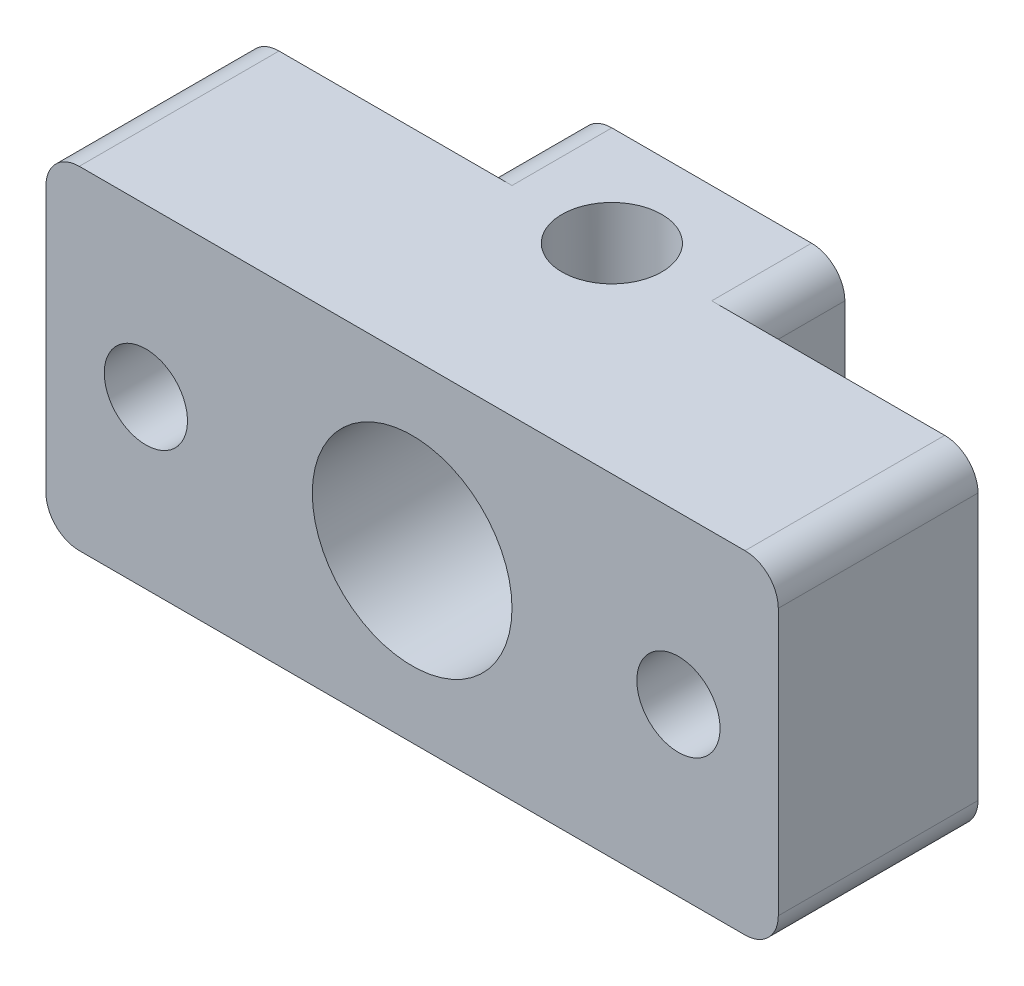
ISO-10303-21;
HEADER;
FILE_DESCRIPTION(('STEP AP214'),'2;1');
FILE_NAME('part.step','',(''),(''),'','','');
FILE_SCHEMA(('AUTOMOTIVE_DESIGN { 1 0 10303 214 1 1 1 1 }'));
ENDSEC;
DATA;
#1=APPLICATION_CONTEXT('core data for automotive mechanical design processes');
#2=APPLICATION_PROTOCOL_DEFINITION('international standard','automotive_design',2000,#1);
#3=PRODUCT_CONTEXT('',#1,'mechanical');
#4=PRODUCT('Part','Part','',(#3));
#5=PRODUCT_RELATED_PRODUCT_CATEGORY('part','',(#4));
#6=PRODUCT_DEFINITION_FORMATION('','',#4);
#7=PRODUCT_DEFINITION_CONTEXT('part definition',#1,'design');
#8=PRODUCT_DEFINITION('design','',#6,#7);
#9=PRODUCT_DEFINITION_SHAPE('','',#8);
#10=(LENGTH_UNIT() NAMED_UNIT(*) SI_UNIT(.MILLI.,.METRE.));
#11=(NAMED_UNIT(*) PLANE_ANGLE_UNIT() SI_UNIT($,.RADIAN.));
#12=(NAMED_UNIT(*) SI_UNIT($,.STERADIAN.) SOLID_ANGLE_UNIT());
#13=UNCERTAINTY_MEASURE_WITH_UNIT(LENGTH_MEASURE(1.E-05),#10,'distance_accuracy_value','');
#14=(GEOMETRIC_REPRESENTATION_CONTEXT(3) GLOBAL_UNCERTAINTY_ASSIGNED_CONTEXT((#13)) GLOBAL_UNIT_ASSIGNED_CONTEXT((#10,
#11,#12)) REPRESENTATION_CONTEXT('',''));
#15=CARTESIAN_POINT('',(0.,0.,0.));
#16=DIRECTION('',(0.,0.,1.));
#17=DIRECTION('',(1.,0.,0.));
#18=AXIS2_PLACEMENT_3D('',#15,#16,#17);
#19=CARTESIAN_POINT('',(0.,0.,9.));
#20=DIRECTION('',(0.,0.,-1.));
#21=DIRECTION('',(-1.,0.,0.));
#22=AXIS2_PLACEMENT_3D('',#19,#20,#21);
#23=PLANE('',#22);
#24=DIRECTION('',(1.,0.,0.));
#25=VECTOR('',#24,1.);
#26=CARTESIAN_POINT('',(-11.,-5.,9.));
#27=LINE('',#26,#25);
#28=CARTESIAN_POINT('',(-10.,-5.,9.));
#29=VERTEX_POINT('',#28);
#30=CARTESIAN_POINT('',(10.,-5.,9.));
#31=VERTEX_POINT('',#30);
#32=EDGE_CURVE('E174',#29,#31,#27,.T.);
#33=ORIENTED_EDGE('',*,*,#32,.T.);
#34=CARTESIAN_POINT('',(10.,-4.,9.));
#35=DIRECTION('',(0.,0.,-1.));
#36=DIRECTION('',(-1.,0.,0.));
#37=AXIS2_PLACEMENT_3D('',#34,#35,#36);
#38=CIRCLE('',#37,1.);
#39=CARTESIAN_POINT('',(11.,-4.,9.));
#40=VERTEX_POINT('',#39);
#41=EDGE_CURVE('E348',#31,#40,#38,.F.);
#42=ORIENTED_EDGE('',*,*,#41,.T.);
#43=DIRECTION('',(0.,1.,0.));
#44=VECTOR('',#43,1.);
#45=CARTESIAN_POINT('',(11.,-5.,9.));
#46=LINE('',#45,#44);
#47=CARTESIAN_POINT('',(11.,4.,9.));
#48=VERTEX_POINT('',#47);
#49=EDGE_CURVE('E228',#40,#48,#46,.T.);
#50=ORIENTED_EDGE('',*,*,#49,.T.);
#51=CARTESIAN_POINT('',(10.,4.,9.));
#52=DIRECTION('',(0.,0.,-1.));
#53=DIRECTION('',(-1.,0.,0.));
#54=AXIS2_PLACEMENT_3D('',#51,#52,#53);
#55=CIRCLE('',#54,1.);
#56=CARTESIAN_POINT('',(10.,5.,9.));
#57=VERTEX_POINT('',#56);
#58=EDGE_CURVE('E341',#48,#57,#55,.F.);
#59=ORIENTED_EDGE('',*,*,#58,.T.);
#60=DIRECTION('',(-1.,0.,0.));
#61=VECTOR('',#60,1.);
#62=CARTESIAN_POINT('',(-11.,5.,9.));
#63=LINE('',#62,#61);
#64=CARTESIAN_POINT('',(-10.,5.,9.));
#65=VERTEX_POINT('',#64);
#66=EDGE_CURVE('E172',#57,#65,#63,.T.);
#67=ORIENTED_EDGE('',*,*,#66,.T.);
#68=CARTESIAN_POINT('',(-10.,4.,9.));
#69=DIRECTION('',(0.,0.,-1.));
#70=DIRECTION('',(-1.,0.,0.));
#71=AXIS2_PLACEMENT_3D('',#68,#69,#70);
#72=CIRCLE('',#71,1.);
#73=CARTESIAN_POINT('',(-11.,4.,9.));
#74=VERTEX_POINT('',#73);
#75=EDGE_CURVE('E343',#65,#74,#72,.F.);
#76=ORIENTED_EDGE('',*,*,#75,.T.);
#77=DIRECTION('',(0.,-1.,0.));
#78=VECTOR('',#77,1.);
#79=CARTESIAN_POINT('',(-11.,-5.,9.));
#80=LINE('',#79,#78);
#81=CARTESIAN_POINT('',(-11.,-4.,9.));
#82=VERTEX_POINT('',#81);
#83=EDGE_CURVE('E233',#74,#82,#80,.T.);
#84=ORIENTED_EDGE('',*,*,#83,.T.);
#85=CARTESIAN_POINT('',(-10.,-4.,9.));
#86=DIRECTION('',(0.,0.,-1.));
#87=DIRECTION('',(-1.,0.,0.));
#88=AXIS2_PLACEMENT_3D('',#85,#86,#87);
#89=CIRCLE('',#88,1.);
#90=EDGE_CURVE('E336',#82,#29,#89,.F.);
#91=ORIENTED_EDGE('',*,*,#90,.T.);
#92=EDGE_LOOP('',(#33,#42,#50,#59,#67,#76,#84,#91));
#93=FACE_BOUND('',#92,.T.);
#94=CARTESIAN_POINT('',(8.,0.,9.));
#95=DIRECTION('',(0.,0.,1.));
#96=DIRECTION('',(1.,0.,0.));
#97=AXIS2_PLACEMENT_3D('',#94,#95,#96);
#98=CIRCLE('',#97,1.25);
#99=CARTESIAN_POINT('',(9.25,0.,9.));
#100=VERTEX_POINT('',#99);
#101=EDGE_CURVE('E224',#100,#100,#98,.T.);
#102=ORIENTED_EDGE('',*,*,#101,.F.);
#103=EDGE_LOOP('',(#102));
#104=FACE_BOUND('',#103,.T.);
#105=CARTESIAN_POINT('',(-8.,0.,9.));
#106=DIRECTION('',(0.,0.,1.));
#107=DIRECTION('',(-1.,0.,0.));
#108=AXIS2_PLACEMENT_3D('',#105,#106,#107);
#109=CIRCLE('',#108,1.25);
#110=CARTESIAN_POINT('',(-9.25,0.,9.));
#111=VERTEX_POINT('',#110);
#112=EDGE_CURVE('E219',#111,#111,#109,.T.);
#113=ORIENTED_EDGE('',*,*,#112,.F.);
#114=EDGE_LOOP('',(#113));
#115=FACE_BOUND('',#114,.T.);
#116=CARTESIAN_POINT('',(0.,0.,9.));
#117=DIRECTION('',(0.,0.,1.));
#118=DIRECTION('',(1.,0.,0.));
#119=AXIS2_PLACEMENT_3D('',#116,#117,#118);
#120=CIRCLE('',#119,3.);
#121=CARTESIAN_POINT('',(3.,0.,9.));
#122=VERTEX_POINT('',#121);
#123=EDGE_CURVE('E216',#122,#122,#120,.T.);
#124=ORIENTED_EDGE('',*,*,#123,.F.);
#125=EDGE_LOOP('',(#124));
#126=FACE_BOUND('',#125,.T.);
#127=ADVANCED_FACE('F37',(#93,#104,#115,#126),#23,.F.);
#128=CARTESIAN_POINT('',(0.,0.,0.));
#129=DIRECTION('',(0.,0.,-1.));
#130=DIRECTION('',(-1.,0.,0.));
#131=AXIS2_PLACEMENT_3D('',#128,#129,#130);
#132=PLANE('',#131);
#133=DIRECTION('',(0.,-1.,0.));
#134=VECTOR('',#133,1.);
#135=CARTESIAN_POINT('',(-4.,5.,0.));
#136=LINE('',#135,#134);
#137=CARTESIAN_POINT('',(-4.,4.,0.));
#138=VERTEX_POINT('',#137);
#139=CARTESIAN_POINT('',(-4.,-4.,0.));
#140=VERTEX_POINT('',#139);
#141=EDGE_CURVE('E196',#138,#140,#136,.T.);
#142=ORIENTED_EDGE('',*,*,#141,.F.);
#143=CARTESIAN_POINT('',(-3.,4.,0.));
#144=DIRECTION('',(0.,0.,-1.));
#145=DIRECTION('',(-1.,0.,0.));
#146=AXIS2_PLACEMENT_3D('',#143,#144,#145);
#147=CIRCLE('',#146,1.);
#148=CARTESIAN_POINT('',(-3.,5.,0.));
#149=VERTEX_POINT('',#148);
#150=EDGE_CURVE('E386',#138,#149,#147,.T.);
#151=ORIENTED_EDGE('',*,*,#150,.T.);
#152=DIRECTION('',(-1.,0.,0.));
#153=VECTOR('',#152,1.);
#154=CARTESIAN_POINT('',(-11.,5.,0.));
#155=LINE('',#154,#153);
#156=CARTESIAN_POINT('',(3.,5.,0.));
#157=VERTEX_POINT('',#156);
#158=EDGE_CURVE('E227',#157,#149,#155,.T.);
#159=ORIENTED_EDGE('',*,*,#158,.F.);
#160=CARTESIAN_POINT('',(3.,4.,0.));
#161=DIRECTION('',(0.,0.,-1.));
#162=DIRECTION('',(-1.,0.,0.));
#163=AXIS2_PLACEMENT_3D('',#160,#161,#162);
#164=CIRCLE('',#163,1.);
#165=CARTESIAN_POINT('',(4.,4.,0.));
#166=VERTEX_POINT('',#165);
#167=EDGE_CURVE('E399',#157,#166,#164,.T.);
#168=ORIENTED_EDGE('',*,*,#167,.T.);
#169=DIRECTION('',(0.,-1.,0.));
#170=VECTOR('',#169,1.);
#171=CARTESIAN_POINT('',(4.,5.,0.));
#172=LINE('',#171,#170);
#173=CARTESIAN_POINT('',(4.,-4.,0.));
#174=VERTEX_POINT('',#173);
#175=EDGE_CURVE('E187',#166,#174,#172,.T.);
#176=ORIENTED_EDGE('',*,*,#175,.T.);
#177=CARTESIAN_POINT('',(3.,-4.,0.));
#178=DIRECTION('',(0.,0.,-1.));
#179=DIRECTION('',(-1.,0.,0.));
#180=AXIS2_PLACEMENT_3D('',#177,#178,#179);
#181=CIRCLE('',#180,1.);
#182=CARTESIAN_POINT('',(3.,-5.,0.));
#183=VERTEX_POINT('',#182);
#184=EDGE_CURVE('E369',#174,#183,#181,.T.);
#185=ORIENTED_EDGE('',*,*,#184,.T.);
#186=DIRECTION('',(1.,0.,0.));
#187=VECTOR('',#186,1.);
#188=CARTESIAN_POINT('',(-11.,-5.,0.));
#189=LINE('',#188,#187);
#190=CARTESIAN_POINT('',(-3.,-5.,0.));
#191=VERTEX_POINT('',#190);
#192=EDGE_CURVE('E231',#191,#183,#189,.T.);
#193=ORIENTED_EDGE('',*,*,#192,.F.);
#194=CARTESIAN_POINT('',(-3.,-4.,0.));
#195=DIRECTION('',(0.,0.,-1.));
#196=DIRECTION('',(-1.,0.,0.));
#197=AXIS2_PLACEMENT_3D('',#194,#195,#196);
#198=CIRCLE('',#197,1.);
#199=EDGE_CURVE('E394',#191,#140,#198,.T.);
#200=ORIENTED_EDGE('',*,*,#199,.T.);
#201=EDGE_LOOP('',(#142,#151,#159,#168,#176,#185,#193,#200));
#202=FACE_BOUND('',#201,.T.);
#203=CARTESIAN_POINT('',(0.,0.,0.));
#204=DIRECTION('',(0.,0.,1.));
#205=DIRECTION('',(1.,0.,0.));
#206=AXIS2_PLACEMENT_3D('',#203,#204,#205);
#207=CIRCLE('',#206,3.);
#208=CARTESIAN_POINT('',(3.,0.,0.));
#209=VERTEX_POINT('',#208);
#210=EDGE_CURVE('E214',#209,#209,#207,.T.);
#211=ORIENTED_EDGE('',*,*,#210,.T.);
#212=EDGE_LOOP('',(#211));
#213=FACE_BOUND('',#212,.T.);
#214=ADVANCED_FACE('F278',(#202,#213),#132,.T.);
#215=CARTESIAN_POINT('',(11.,-5.,9.));
#216=DIRECTION('',(-1.,0.,0.));
#217=DIRECTION('',(0.,0.,1.));
#218=AXIS2_PLACEMENT_3D('',#215,#216,#217);
#219=PLANE('',#218);
#220=ORIENTED_EDGE('',*,*,#49,.F.);
#221=DIRECTION('',(0.,0.,-1.));
#222=VECTOR('',#221,1.);
#223=CARTESIAN_POINT('',(11.,-4.,9.));
#224=LINE('',#223,#222);
#225=CARTESIAN_POINT('',(11.,-4.,3.));
#226=VERTEX_POINT('',#225);
#227=EDGE_CURVE('E163',#40,#226,#224,.T.);
#228=ORIENTED_EDGE('',*,*,#227,.T.);
#229=DIRECTION('',(0.,-1.,0.));
#230=VECTOR('',#229,1.);
#231=CARTESIAN_POINT('',(11.,5.,3.));
#232=LINE('',#231,#230);
#233=CARTESIAN_POINT('',(11.,4.,3.));
#234=VERTEX_POINT('',#233);
#235=EDGE_CURVE('E180',#234,#226,#232,.T.);
#236=ORIENTED_EDGE('',*,*,#235,.F.);
#237=DIRECTION('',(0.,0.,-1.));
#238=VECTOR('',#237,1.);
#239=CARTESIAN_POINT('',(11.,4.,9.));
#240=LINE('',#239,#238);
#241=EDGE_CURVE('E157',#234,#48,#240,.F.);
#242=ORIENTED_EDGE('',*,*,#241,.T.);
#243=EDGE_LOOP('',(#220,#228,#236,#242));
#244=FACE_BOUND('',#243,.T.);
#245=ADVANCED_FACE('F284',(#244),#219,.F.);
#246=CARTESIAN_POINT('',(-11.,5.,9.));
#247=DIRECTION('',(0.,-1.,0.));
#248=DIRECTION('',(0.,0.,-1.));
#249=AXIS2_PLACEMENT_3D('',#246,#247,#248);
#250=PLANE('',#249);
#251=CARTESIAN_POINT('',(0.,5.,3.));
#252=DIRECTION('',(0.,-1.,0.));
#253=DIRECTION('',(0.,0.,-1.));
#254=AXIS2_PLACEMENT_3D('',#251,#252,#253);
#255=CIRCLE('',#254,1.5);
#256=CARTESIAN_POINT('',(0.,5.,1.5));
#257=VERTEX_POINT('',#256);
#258=EDGE_CURVE('E211',#257,#257,#255,.T.);
#259=ORIENTED_EDGE('',*,*,#258,.T.);
#260=EDGE_LOOP('',(#259));
#261=FACE_BOUND('',#260,.T.);
#262=ORIENTED_EDGE('',*,*,#158,.T.);
#263=DIRECTION('',(0.,0.,1.));
#264=VECTOR('',#263,1.);
#265=CARTESIAN_POINT('',(-3.,5.,9.));
#266=LINE('',#265,#264);
#267=CARTESIAN_POINT('',(-3.,5.,3.));
#268=VERTEX_POINT('',#267);
#269=EDGE_CURVE('E406',#149,#268,#266,.T.);
#270=ORIENTED_EDGE('',*,*,#269,.T.);
#271=DIRECTION('',(-1.,0.,0.));
#272=VECTOR('',#271,1.);
#273=CARTESIAN_POINT('',(-11.,5.,3.));
#274=LINE('',#273,#272);
#275=CARTESIAN_POINT('',(-10.,5.,3.));
#276=VERTEX_POINT('',#275);
#277=EDGE_CURVE('E193',#268,#276,#274,.T.);
#278=ORIENTED_EDGE('',*,*,#277,.T.);
#279=DIRECTION('',(0.,0.,-1.));
#280=VECTOR('',#279,1.);
#281=CARTESIAN_POINT('',(-10.,5.,9.));
#282=LINE('',#281,#280);
#283=EDGE_CURVE('E173',#276,#65,#282,.F.);
#284=ORIENTED_EDGE('',*,*,#283,.T.);
#285=ORIENTED_EDGE('',*,*,#66,.F.);
#286=DIRECTION('',(0.,0.,-1.));
#287=VECTOR('',#286,1.);
#288=CARTESIAN_POINT('',(10.,5.,9.));
#289=LINE('',#288,#287);
#290=CARTESIAN_POINT('',(10.,5.,3.));
#291=VERTEX_POINT('',#290);
#292=EDGE_CURVE('E156',#57,#291,#289,.T.);
#293=ORIENTED_EDGE('',*,*,#292,.T.);
#294=DIRECTION('',(-1.,0.,0.));
#295=VECTOR('',#294,1.);
#296=CARTESIAN_POINT('',(11.,5.,3.));
#297=LINE('',#296,#295);
#298=CARTESIAN_POINT('',(3.,5.,3.));
#299=VERTEX_POINT('',#298);
#300=EDGE_CURVE('E170',#291,#299,#297,.T.);
#301=ORIENTED_EDGE('',*,*,#300,.T.);
#302=DIRECTION('',(0.,0.,-1.));
#303=VECTOR('',#302,1.);
#304=CARTESIAN_POINT('',(3.,5.,9.));
#305=LINE('',#304,#303);
#306=EDGE_CURVE('E409',#299,#157,#305,.T.);
#307=ORIENTED_EDGE('',*,*,#306,.T.);
#308=EDGE_LOOP('',(#262,#270,#278,#284,#285,#293,#301,#307));
#309=FACE_BOUND('',#308,.T.);
#310=ADVANCED_FACE('F168',(#261,#309),#250,.F.);
#311=CARTESIAN_POINT('',(-11.,-5.,9.));
#312=DIRECTION('',(1.,0.,0.));
#313=DIRECTION('',(0.,0.,-1.));
#314=AXIS2_PLACEMENT_3D('',#311,#312,#313);
#315=PLANE('',#314);
#316=ORIENTED_EDGE('',*,*,#83,.F.);
#317=DIRECTION('',(0.,0.,-1.));
#318=VECTOR('',#317,1.);
#319=CARTESIAN_POINT('',(-11.,4.,9.));
#320=LINE('',#319,#318);
#321=CARTESIAN_POINT('',(-11.,4.,3.));
#322=VERTEX_POINT('',#321);
#323=EDGE_CURVE('E351',#74,#322,#320,.T.);
#324=ORIENTED_EDGE('',*,*,#323,.T.);
#325=DIRECTION('',(0.,-1.,0.));
#326=VECTOR('',#325,1.);
#327=CARTESIAN_POINT('',(-11.,5.,3.));
#328=LINE('',#327,#326);
#329=CARTESIAN_POINT('',(-11.,-4.,3.));
#330=VERTEX_POINT('',#329);
#331=EDGE_CURVE('E199',#322,#330,#328,.T.);
#332=ORIENTED_EDGE('',*,*,#331,.T.);
#333=DIRECTION('',(0.,0.,-1.));
#334=VECTOR('',#333,1.);
#335=CARTESIAN_POINT('',(-11.,-4.,9.));
#336=LINE('',#335,#334);
#337=EDGE_CURVE('E337',#330,#82,#336,.F.);
#338=ORIENTED_EDGE('',*,*,#337,.T.);
#339=EDGE_LOOP('',(#316,#324,#332,#338));
#340=FACE_BOUND('',#339,.T.);
#341=ADVANCED_FACE('F294',(#340),#315,.F.);
#342=CARTESIAN_POINT('',(-11.,-5.,9.));
#343=DIRECTION('',(0.,1.,0.));
#344=DIRECTION('',(0.,0.,1.));
#345=AXIS2_PLACEMENT_3D('',#342,#343,#344);
#346=PLANE('',#345);
#347=CARTESIAN_POINT('',(0.,-5.,3.));
#348=DIRECTION('',(0.,-1.,0.));
#349=DIRECTION('',(0.,0.,-1.));
#350=AXIS2_PLACEMENT_3D('',#347,#348,#349);
#351=CIRCLE('',#350,1.5);
#352=CARTESIAN_POINT('',(0.,-5.,1.5));
#353=VERTEX_POINT('',#352);
#354=EDGE_CURVE('E207',#353,#353,#351,.T.);
#355=ORIENTED_EDGE('',*,*,#354,.F.);
#356=EDGE_LOOP('',(#355));
#357=FACE_BOUND('',#356,.T.);
#358=DIRECTION('',(-1.,0.,0.));
#359=VECTOR('',#358,1.);
#360=CARTESIAN_POINT('',(-11.,-5.,3.));
#361=LINE('',#360,#359);
#362=CARTESIAN_POINT('',(-3.,-5.,3.));
#363=VERTEX_POINT('',#362);
#364=CARTESIAN_POINT('',(-10.,-5.,3.));
#365=VERTEX_POINT('',#364);
#366=EDGE_CURVE('E197',#363,#365,#361,.T.);
#367=ORIENTED_EDGE('',*,*,#366,.F.);
#368=DIRECTION('',(0.,0.,1.));
#369=VECTOR('',#368,1.);
#370=CARTESIAN_POINT('',(-3.,-5.,9.));
#371=LINE('',#370,#369);
#372=EDGE_CURVE('E372',#363,#191,#371,.F.);
#373=ORIENTED_EDGE('',*,*,#372,.T.);
#374=ORIENTED_EDGE('',*,*,#192,.T.);
#375=DIRECTION('',(0.,0.,-1.));
#376=VECTOR('',#375,1.);
#377=CARTESIAN_POINT('',(3.,-5.,9.));
#378=LINE('',#377,#376);
#379=CARTESIAN_POINT('',(3.,-5.,3.));
#380=VERTEX_POINT('',#379);
#381=EDGE_CURVE('E383',#183,#380,#378,.F.);
#382=ORIENTED_EDGE('',*,*,#381,.T.);
#383=DIRECTION('',(-1.,0.,0.));
#384=VECTOR('',#383,1.);
#385=CARTESIAN_POINT('',(11.,-5.,3.));
#386=LINE('',#385,#384);
#387=CARTESIAN_POINT('',(10.,-5.,3.));
#388=VERTEX_POINT('',#387);
#389=EDGE_CURVE('E181',#388,#380,#386,.T.);
#390=ORIENTED_EDGE('',*,*,#389,.F.);
#391=DIRECTION('',(0.,0.,-1.));
#392=VECTOR('',#391,1.);
#393=CARTESIAN_POINT('',(10.,-5.,9.));
#394=LINE('',#393,#392);
#395=EDGE_CURVE('E382',#388,#31,#394,.F.);
#396=ORIENTED_EDGE('',*,*,#395,.T.);
#397=ORIENTED_EDGE('',*,*,#32,.F.);
#398=DIRECTION('',(0.,0.,-1.));
#399=VECTOR('',#398,1.);
#400=CARTESIAN_POINT('',(-10.,-5.,9.));
#401=LINE('',#400,#399);
#402=EDGE_CURVE('E339',#29,#365,#401,.T.);
#403=ORIENTED_EDGE('',*,*,#402,.T.);
#404=EDGE_LOOP('',(#367,#373,#374,#382,#390,#396,#397,#403));
#405=FACE_BOUND('',#404,.T.);
#406=ADVANCED_FACE('F291',(#357,#405),#346,.F.);
#407=CARTESIAN_POINT('',(8.,0.,9.));
#408=DIRECTION('',(0.,0.,-1.));
#409=DIRECTION('',(-1.,0.,0.));
#410=AXIS2_PLACEMENT_3D('',#407,#408,#409);
#411=CYLINDRICAL_SURFACE('',#410,1.25);
#412=CARTESIAN_POINT('',(8.,0.,3.));
#413=DIRECTION('',(0.,0.,1.));
#414=DIRECTION('',(1.,0.,0.));
#415=AXIS2_PLACEMENT_3D('',#412,#413,#414);
#416=CIRCLE('',#415,1.25);
#417=CARTESIAN_POINT('',(9.25,0.,3.));
#418=VERTEX_POINT('',#417);
#419=EDGE_CURVE('E190',#418,#418,#416,.T.);
#420=ORIENTED_EDGE('',*,*,#419,.F.);
#421=EDGE_LOOP('',(#420));
#422=FACE_BOUND('',#421,.T.);
#423=ORIENTED_EDGE('',*,*,#101,.T.);
#424=EDGE_LOOP('',(#423));
#425=FACE_BOUND('',#424,.T.);
#426=ADVANCED_FACE('F289',(#422,#425),#411,.F.);
#427=CARTESIAN_POINT('',(-8.,0.,9.));
#428=DIRECTION('',(0.,0.,-1.));
#429=DIRECTION('',(-1.,0.,0.));
#430=AXIS2_PLACEMENT_3D('',#427,#428,#429);
#431=CYLINDRICAL_SURFACE('',#430,1.25);
#432=CARTESIAN_POINT('',(-8.,0.,3.));
#433=DIRECTION('',(0.,0.,1.));
#434=DIRECTION('',(1.,0.,0.));
#435=AXIS2_PLACEMENT_3D('',#432,#433,#434);
#436=CIRCLE('',#435,1.25);
#437=CARTESIAN_POINT('',(-6.75,0.,3.));
#438=VERTEX_POINT('',#437);
#439=EDGE_CURVE('E201',#438,#438,#436,.T.);
#440=ORIENTED_EDGE('',*,*,#439,.F.);
#441=EDGE_LOOP('',(#440));
#442=FACE_BOUND('',#441,.T.);
#443=ORIENTED_EDGE('',*,*,#112,.T.);
#444=EDGE_LOOP('',(#443));
#445=FACE_BOUND('',#444,.T.);
#446=ADVANCED_FACE('F416',(#442,#445),#431,.F.);
#447=CARTESIAN_POINT('',(0.,0.,9.));
#448=DIRECTION('',(0.,0.,-1.));
#449=DIRECTION('',(-1.,0.,0.));
#450=AXIS2_PLACEMENT_3D('',#447,#448,#449);
#451=CYLINDRICAL_SURFACE('',#450,3.);
#452=CARTESIAN_POINT('',(0.,3.,1.5));
#453=CARTESIAN_POINT('',(0.0788579444268502,2.99999570107562,1.50000495347579));
#454=CARTESIAN_POINT('',(0.157809899546344,2.99685736529635,1.50625510968158));
#455=CARTESIAN_POINT('',(0.313380352903344,2.98461234055736,1.53097932051231));
#456=CARTESIAN_POINT('',(0.389994130070444,2.9754943174338,1.54947658949672));
#457=CARTESIAN_POINT('',(0.538400317320673,2.95224419105063,1.59779071292494));
#458=CARTESIAN_POINT('',(0.610210204408719,2.93813158766306,1.62756357637195));
#459=CARTESIAN_POINT('',(0.747708925209898,2.90618664773642,1.69735593204748));
#460=CARTESIAN_POINT('',(0.813398240985089,2.88835460450288,1.7373746163733));
#461=CARTESIAN_POINT('',(0.941261726642864,2.84934387387093,1.82927587422793));
#462=CARTESIAN_POINT('',(1.00298281668316,2.82802798691306,1.88172971885946));
#463=CARTESIAN_POINT('',(1.11716916730047,2.78489955370115,1.99578221887055));
#464=CARTESIAN_POINT('',(1.16962737466015,2.76308664313552,2.05738777765866));
#465=CARTESIAN_POINT('',(1.26787800067542,2.71948426796021,2.19372502428507));
#466=CARTESIAN_POINT('',(1.31283800332746,2.69782780455198,2.26910414751887));
#467=CARTESIAN_POINT('',(1.38925234033604,2.65928968158481,2.42755100397932));
#468=CARTESIAN_POINT('',(1.4207163224495,2.64240461410485,2.51061319308412));
#469=CARTESIAN_POINT('',(1.46719866328288,2.61686800556713,2.67699765813288));
#470=CARTESIAN_POINT('',(1.48308878562066,2.6077840737557,2.76000667810109));
#471=CARTESIAN_POINT('',(1.50064048996327,2.59772834922792,2.92796825666921));
#472=CARTESIAN_POINT('',(1.50231613255961,2.59674854014932,3.01291881130673));
#473=CARTESIAN_POINT('',(1.49203093075844,2.60266395385873,3.17142903647305));
#474=CARTESIAN_POINT('',(1.48167683930523,2.6086314549302,3.24513604683457));
#475=CARTESIAN_POINT('',(1.4504097735854,2.62614343100776,3.38958286405956));
#476=CARTESIAN_POINT('',(1.42949343584648,2.63768968247665,3.46032171795797));
#477=CARTESIAN_POINT('',(1.37731467057901,2.66531214619112,3.59884369884849));
#478=CARTESIAN_POINT('',(1.34582260067399,2.68148760995998,3.66651959817868));
#479=CARTESIAN_POINT('',(1.273562531502,2.71655106422106,3.79595143888501));
#480=CARTESIAN_POINT('',(1.2327903657187,2.73544027170286,3.85770470340013));
#481=CARTESIAN_POINT('',(1.13709908236918,2.77669736854929,3.98178187911484));
#482=CARTESIAN_POINT('',(1.08104168755392,2.79920265355119,4.04318531036424));
#483=CARTESIAN_POINT('',(0.95933336811206,2.84321434950611,4.15610312788635));
#484=CARTESIAN_POINT('',(0.893677884861428,2.86472027938202,4.20761278805082));
#485=CARTESIAN_POINT('',(0.750774758747773,2.90552980924446,4.30152849154459));
#486=CARTESIAN_POINT('',(0.673130387399113,2.92468476243011,4.34340070866861));
#487=CARTESIAN_POINT('',(0.510699323233195,2.95736821681864,4.41314554356451));
#488=CARTESIAN_POINT('',(0.425918364397914,2.9709011841533,4.44102927752275));
#489=CARTESIAN_POINT('',(0.259149737491053,2.98986500612153,4.47971310557501));
#490=CARTESIAN_POINT('',(0.177512295822489,2.99587407451965,4.49173685362017));
#491=CARTESIAN_POINT('',(0.0131693999240272,3.00109520188656,4.50219709670173));
#492=CARTESIAN_POINT('',(-0.0695355298048633,3.00031048081978,4.5006400284592));
#493=CARTESIAN_POINT('',(-0.226849457978981,2.99236788380153,4.48468996737188));
#494=CARTESIAN_POINT('',(-0.301589112074895,2.98570868532253,4.47130120090501));
#495=CARTESIAN_POINT('',(-0.447610338452912,2.96733256972261,4.43364289215732));
#496=CARTESIAN_POINT('',(-0.51889152853663,2.95561509501618,4.40937215031976));
#497=CARTESIAN_POINT('',(-0.658332912674359,2.92776377120382,4.35000230035045));
#498=CARTESIAN_POINT('',(-0.726345595508705,2.91151322654446,4.31461342482557));
#499=CARTESIAN_POINT('',(-0.855692042548907,2.87615961476127,4.23433869653015));
#500=CARTESIAN_POINT('',(-0.917022944664887,2.85705533350408,4.18944879810691));
#501=CARTESIAN_POINT('',(-1.03765153393382,2.81562332004297,4.08635936200392));
#502=CARTESIAN_POINT('',(-1.09615811672854,2.79316327265249,4.02728569733228));
#503=CARTESIAN_POINT('',(-1.20278448167828,2.7489358741323,3.90011227308341));
#504=CARTESIAN_POINT('',(-1.25089707856781,2.72716901100071,3.83200632172812));
#505=CARTESIAN_POINT('',(-1.33756187171853,2.68576788309734,3.68453451874054));
#506=CARTESIAN_POINT('',(-1.37553824370037,2.66628794383591,3.60478310085828));
#507=CARTESIAN_POINT('',(-1.43712423890206,2.63361108441202,3.43873489863755));
#508=CARTESIAN_POINT('',(-1.46075237380052,2.62040607332625,3.35244671029966));
#509=CARTESIAN_POINT('',(-1.49079253120031,2.60342251538703,3.18463466567294));
#510=CARTESIAN_POINT('',(-1.49863949460818,2.59886075197598,3.10344861984714));
#511=CARTESIAN_POINT('',(-1.5010337315643,2.59748031962405,2.94082939925321));
#512=CARTESIAN_POINT('',(-1.49558676993486,2.60065829439585,2.85939634689321));
#513=CARTESIAN_POINT('',(-1.47288918838996,2.61356793076615,2.70677474769984));
#514=CARTESIAN_POINT('',(-1.45681247151455,2.62264641723988,2.63534929478289));
#515=CARTESIAN_POINT('',(-1.41476303733662,2.64556524281479,2.49628782086345));
#516=CARTESIAN_POINT('',(-1.38878713673988,2.65940711354503,2.42865302686195));
#517=CARTESIAN_POINT('',(-1.32572361795085,2.69142795546804,2.29406272352019));
#518=CARTESIAN_POINT('',(-1.28800670672355,2.70983583593881,2.22745814725646));
#519=CARTESIAN_POINT('',(-1.20322645745609,2.74852997452291,2.10108819572811));
#520=CARTESIAN_POINT('',(-1.15615825686234,2.76881720693416,2.04132640421833));
#521=CARTESIAN_POINT('',(-1.04730498999206,2.81193484737138,1.92278702646799));
#522=CARTESIAN_POINT('',(-0.984426634495892,2.83477474959942,1.86501134647456));
#523=CARTESIAN_POINT('',(-0.849232209349796,2.87816628389896,1.76060552484709));
#524=CARTESIAN_POINT('',(-0.776911084957796,2.89871667939293,1.71398139079514));
#525=CARTESIAN_POINT('',(-0.623897395174419,2.93547014349806,1.63314545593189));
#526=CARTESIAN_POINT('',(-0.543149255665096,2.951641447409,1.5990237461453));
#527=CARTESIAN_POINT('',(-0.37611315170713,2.9775201194848,1.54528774836389));
#528=CARTESIAN_POINT('',(-0.28984169938365,2.98724585044602,1.52563222979143));
#529=CARTESIAN_POINT('',(-0.168902919736343,2.99543192870217,1.50915388337139));
#530=CARTESIAN_POINT('',(-0.135242819162348,2.99714048010376,1.50572603870049));
#531=CARTESIAN_POINT('',(-0.067727597707638,2.99942545465223,1.50114800172887));
#532=CARTESIAN_POINT('',(-0.033872471469943,3.00000184655071,1.49999787229469));
#533=CARTESIAN_POINT('',(0.,3.,1.5));
#534=B_SPLINE_CURVE_WITH_KNOTS('',3,(#452,#453,#454,#455,#456,#457,#458,#459,#460,#461,#462,
#463,#464,#465,#466,#467,#468,#469,#470,#471,#472,#473,#474,#475,#476,#477,#478,#479,#480,#481,
#482,#483,#484,#485,#486,#487,#488,#489,#490,#491,#492,#493,#494,#495,#496,#497,#498,#499,#500,
#501,#502,#503,#504,#505,#506,#507,#508,#509,#510,#511,#512,#513,#514,#515,#516,#517,#518,#519,
#520,#521,#522,#523,#524,#525,#526,#527,#528,#529,#530,#531,#532,#533),.UNSPECIFIED.,.T.,.F.,(4,
2,2,2,2,2,2,2,2,2,2,2,2,2,2,2,2,2,2,2,2,2,2,2,2,2,2,2,2,2,2,2,2,2,2,2,2,2,2,2,4),(0.,
0.236436386130439,0.473322224563797,0.709293233238448,0.945245640872352,1.19547263807713,
1.44588935648105,1.71572589646129,1.98536921847421,2.23887018210344,2.49212035993531,
2.71508568613981,2.93812205888518,3.16635360252731,3.39468781890333,3.65197412000818,
3.9093830189803,4.17874533321661,4.4478932536842,4.69474935707019,4.94148846767214,
5.16910359759183,5.39674382446397,5.63089284041848,5.86514176122509,6.12239415966628,
6.37982382923148,6.64972023242589,6.91926767918176,7.1629396125457,7.40650589797018,
7.62686895373284,7.84730293182527,8.08254685170431,8.31791341715446,8.58187864135757,
8.84598575071869,9.1119602049529,9.37717362931724,9.47872920200875,9.58028757766599),.UNSPECIFIED.);
#535=CARTESIAN_POINT('',(0.,3.,1.5));
#536=VERTEX_POINT('',#535);
#537=EDGE_CURVE('E215',#536,#536,#534,.T.);
#538=ORIENTED_EDGE('',*,*,#537,.F.);
#539=EDGE_LOOP('',(#538));
#540=FACE_BOUND('',#539,.T.);
#541=CARTESIAN_POINT('',(0.,-3.,1.5));
#542=CARTESIAN_POINT('',(-0.0788579444268502,-2.99999570107562,1.50000495347579));
#543=CARTESIAN_POINT('',(-0.157809899546344,-2.99685736529634,1.50625510968158));
#544=CARTESIAN_POINT('',(-0.313380352903344,-2.98461234055735,1.53097932051231));
#545=CARTESIAN_POINT('',(-0.389994130070444,-2.97549431743379,1.54947658949672));
#546=CARTESIAN_POINT('',(-0.538400317320674,-2.95224419105063,1.59779071292494));
#547=CARTESIAN_POINT('',(-0.61021020440872,-2.93813158766306,1.62756357637195));
#548=CARTESIAN_POINT('',(-0.747708925209898,-2.90618664773642,1.69735593204748));
#549=CARTESIAN_POINT('',(-0.813398240985089,-2.88835460450288,1.7373746163733));
#550=CARTESIAN_POINT('',(-0.941261726642864,-2.84934387387093,1.82927587422793));
#551=CARTESIAN_POINT('',(-1.00298281668316,-2.82802798691306,1.88172971885946));
#552=CARTESIAN_POINT('',(-1.11716916730047,-2.78489955370114,1.99578221887055));
#553=CARTESIAN_POINT('',(-1.16962737466015,-2.76308664313552,2.05738777765866));
#554=CARTESIAN_POINT('',(-1.26787800067542,-2.71948426796021,2.19372502428507));
#555=CARTESIAN_POINT('',(-1.31283800332746,-2.69782780455198,2.26910414751887));
#556=CARTESIAN_POINT('',(-1.38925234033604,-2.65928968158481,2.42755100397932));
#557=CARTESIAN_POINT('',(-1.4207163224495,-2.64240461410484,2.51061319308412));
#558=CARTESIAN_POINT('',(-1.46719866328288,-2.61686800556713,2.67699765813288));
#559=CARTESIAN_POINT('',(-1.48308878562066,-2.6077840737557,2.76000667810109));
#560=CARTESIAN_POINT('',(-1.50064048996327,-2.59772834922791,2.92796825666921));
#561=CARTESIAN_POINT('',(-1.50231613255961,-2.59674854014932,3.01291881130673));
#562=CARTESIAN_POINT('',(-1.49203093075844,-2.60266395385873,3.17142903647305));
#563=CARTESIAN_POINT('',(-1.48167683930523,-2.6086314549302,3.24513604683457));
#564=CARTESIAN_POINT('',(-1.4504097735854,-2.62614343100775,3.38958286405956));
#565=CARTESIAN_POINT('',(-1.42949343584648,-2.63768968247664,3.46032171795797));
#566=CARTESIAN_POINT('',(-1.37731467057901,-2.66531214619111,3.59884369884849));
#567=CARTESIAN_POINT('',(-1.34582260067399,-2.68148760995998,3.66651959817868));
#568=CARTESIAN_POINT('',(-1.273562531502,-2.71655106422105,3.79595143888501));
#569=CARTESIAN_POINT('',(-1.2327903657187,-2.73544027170286,3.85770470340013));
#570=CARTESIAN_POINT('',(-1.13709908236918,-2.77669736854929,3.98178187911484));
#571=CARTESIAN_POINT('',(-1.08104168755392,-2.79920265355119,4.04318531036424));
#572=CARTESIAN_POINT('',(-0.95933336811206,-2.84321434950611,4.15610312788635));
#573=CARTESIAN_POINT('',(-0.893677884861428,-2.86472027938201,4.20761278805082));
#574=CARTESIAN_POINT('',(-0.750774758747773,-2.90552980924446,4.30152849154459));
#575=CARTESIAN_POINT('',(-0.673130387399113,-2.92468476243011,4.34340070866861));
#576=CARTESIAN_POINT('',(-0.510699323233195,-2.95736821681863,4.41314554356451));
#577=CARTESIAN_POINT('',(-0.425918364397914,-2.9709011841533,4.44102927752275));
#578=CARTESIAN_POINT('',(-0.259149737491053,-2.98986500612153,4.47971310557501));
#579=CARTESIAN_POINT('',(-0.177512295822489,-2.99587407451965,4.49173685362017));
#580=CARTESIAN_POINT('',(-0.0131693999240273,-3.00109520188655,4.50219709670173));
#581=CARTESIAN_POINT('',(0.0695355298048633,-3.00031048081978,4.5006400284592));
#582=CARTESIAN_POINT('',(0.226849457978981,-2.99236788380152,4.48468996737188));
#583=CARTESIAN_POINT('',(0.301589112074895,-2.98570868532252,4.47130120090501));
#584=CARTESIAN_POINT('',(0.447610338452912,-2.9673325697226,4.43364289215732));
#585=CARTESIAN_POINT('',(0.51889152853663,-2.95561509501618,4.40937215031976));
#586=CARTESIAN_POINT('',(0.658332912674359,-2.92776377120382,4.35000230035045));
#587=CARTESIAN_POINT('',(0.726345595508705,-2.91151322654446,4.31461342482557));
#588=CARTESIAN_POINT('',(0.855692042548907,-2.87615961476126,4.23433869653015));
#589=CARTESIAN_POINT('',(0.917022944664887,-2.85705533350407,4.18944879810691));
#590=CARTESIAN_POINT('',(1.03765153393382,-2.81562332004297,4.08635936200392));
#591=CARTESIAN_POINT('',(1.09615811672854,-2.79316327265249,4.02728569733228));
#592=CARTESIAN_POINT('',(1.20278448167828,-2.7489358741323,3.90011227308341));
#593=CARTESIAN_POINT('',(1.25089707856781,-2.7271690110007,3.83200632172812));
#594=CARTESIAN_POINT('',(1.33756187171853,-2.68576788309734,3.68453451874054));
#595=CARTESIAN_POINT('',(1.37553824370037,-2.66628794383591,3.60478310085828));
#596=CARTESIAN_POINT('',(1.43712423890206,-2.63361108441202,3.43873489863755));
#597=CARTESIAN_POINT('',(1.46075237380052,-2.62040607332625,3.35244671029966));
#598=CARTESIAN_POINT('',(1.49079253120031,-2.60342251538703,3.18463466567294));
#599=CARTESIAN_POINT('',(1.49863949460818,-2.59886075197597,3.10344861984714));
#600=CARTESIAN_POINT('',(1.5010337315643,-2.59748031962405,2.94082939925321));
#601=CARTESIAN_POINT('',(1.49558676993486,-2.60065829439585,2.85939634689321));
#602=CARTESIAN_POINT('',(1.47288918838996,-2.61356793076615,2.70677474769984));
#603=CARTESIAN_POINT('',(1.45681247151455,-2.62264641723988,2.63534929478289));
#604=CARTESIAN_POINT('',(1.41476303733662,-2.64556524281479,2.49628782086345));
#605=CARTESIAN_POINT('',(1.38878713673988,-2.65940711354503,2.42865302686195));
#606=CARTESIAN_POINT('',(1.32572361795085,-2.69142795546803,2.29406272352019));
#607=CARTESIAN_POINT('',(1.28800670672355,-2.70983583593881,2.22745814725646));
#608=CARTESIAN_POINT('',(1.20322645745609,-2.7485299745229,2.10108819572811));
#609=CARTESIAN_POINT('',(1.15615825686234,-2.76881720693416,2.04132640421833));
#610=CARTESIAN_POINT('',(1.04730498999206,-2.81193484737138,1.92278702646799));
#611=CARTESIAN_POINT('',(0.984426634495892,-2.83477474959942,1.86501134647456));
#612=CARTESIAN_POINT('',(0.849232209349796,-2.87816628389896,1.76060552484709));
#613=CARTESIAN_POINT('',(0.776911084957796,-2.89871667939293,1.71398139079514));
#614=CARTESIAN_POINT('',(0.623897395174419,-2.93547014349806,1.63314545593189));
#615=CARTESIAN_POINT('',(0.543149255665096,-2.95164144740899,1.5990237461453));
#616=CARTESIAN_POINT('',(0.37611315170713,-2.9775201194848,1.54528774836389));
#617=CARTESIAN_POINT('',(0.28984169938365,-2.98724585044602,1.52563222979143));
#618=CARTESIAN_POINT('',(0.168902919736343,-2.99543192870217,1.50915388337139));
#619=CARTESIAN_POINT('',(0.135242819162348,-2.99714048010376,1.50572603870049));
#620=CARTESIAN_POINT('',(0.067727597707638,-2.99942545465223,1.50114800172887));
#621=CARTESIAN_POINT('',(0.033872471469943,-3.00000184655071,1.49999787229469));
#622=CARTESIAN_POINT('',(0.,-3.,1.5));
#623=B_SPLINE_CURVE_WITH_KNOTS('',3,(#541,#542,#543,#544,#545,#546,#547,#548,#549,#550,#551,
#552,#553,#554,#555,#556,#557,#558,#559,#560,#561,#562,#563,#564,#565,#566,#567,#568,#569,#570,
#571,#572,#573,#574,#575,#576,#577,#578,#579,#580,#581,#582,#583,#584,#585,#586,#587,#588,#589,
#590,#591,#592,#593,#594,#595,#596,#597,#598,#599,#600,#601,#602,#603,#604,#605,#606,#607,#608,
#609,#610,#611,#612,#613,#614,#615,#616,#617,#618,#619,#620,#621,#622),.UNSPECIFIED.,.T.,.F.,(4,
2,2,2,2,2,2,2,2,2,2,2,2,2,2,2,2,2,2,2,2,2,2,2,2,2,2,2,2,2,2,2,2,2,2,2,2,2,2,2,4),(0.,
0.236436386130439,0.473322224563797,0.709293233238448,0.945245640872352,1.19547263807713,
1.44588935648105,1.71572589646129,1.98536921847421,2.23887018210344,2.49212035993531,
2.71508568613981,2.93812205888518,3.16635360252731,3.39468781890333,3.65197412000818,
3.9093830189803,4.17874533321661,4.4478932536842,4.69474935707019,4.94148846767214,
5.16910359759183,5.39674382446397,5.63089284041848,5.86514176122509,6.12239415966628,
6.37982382923148,6.64972023242589,6.91926767918176,7.1629396125457,7.40650589797018,
7.62686895373284,7.84730293182527,8.08254685170431,8.31791341715446,8.58187864135757,
8.84598575071869,9.1119602049529,9.37717362931724,9.47872920200875,9.58028757766599),.UNSPECIFIED.);
#624=CARTESIAN_POINT('',(0.,-3.,1.5));
#625=VERTEX_POINT('',#624);
#626=EDGE_CURVE('E210',#625,#625,#623,.T.);
#627=ORIENTED_EDGE('',*,*,#626,.F.);
#628=EDGE_LOOP('',(#627));
#629=FACE_BOUND('',#628,.T.);
#630=ORIENTED_EDGE('',*,*,#123,.T.);
#631=EDGE_LOOP('',(#630));
#632=FACE_BOUND('',#631,.T.);
#633=ORIENTED_EDGE('',*,*,#210,.F.);
#634=EDGE_LOOP('',(#633));
#635=FACE_BOUND('',#634,.T.);
#636=ADVANCED_FACE('F250',(#540,#629,#632,#635),#451,.F.);
#637=CARTESIAN_POINT('',(0.,6.,3.));
#638=DIRECTION('',(0.,-1.,0.));
#639=DIRECTION('',(0.,0.,-1.));
#640=AXIS2_PLACEMENT_3D('',#637,#638,#639);
#641=CYLINDRICAL_SURFACE('',#640,1.5);
#642=ORIENTED_EDGE('',*,*,#626,.T.);
#643=EDGE_LOOP('',(#642));
#644=FACE_BOUND('',#643,.T.);
#645=ORIENTED_EDGE('',*,*,#354,.T.);
#646=EDGE_LOOP('',(#645));
#647=FACE_BOUND('',#646,.T.);
#648=ADVANCED_FACE('F253',(#644,#647),#641,.F.);
#649=ORIENTED_EDGE('',*,*,#537,.T.);
#650=EDGE_LOOP('',(#649));
#651=FACE_BOUND('',#650,.T.);
#652=ORIENTED_EDGE('',*,*,#258,.F.);
#653=EDGE_LOOP('',(#652));
#654=FACE_BOUND('',#653,.T.);
#655=ADVANCED_FACE('F257',(#651,#654),#641,.F.);
#656=CARTESIAN_POINT('',(-11.,5.,3.));
#657=DIRECTION('',(0.,0.,1.));
#658=DIRECTION('',(1.,0.,0.));
#659=AXIS2_PLACEMENT_3D('',#656,#657,#658);
#660=PLANE('',#659);
#661=ORIENTED_EDGE('',*,*,#439,.T.);
#662=EDGE_LOOP('',(#661));
#663=FACE_BOUND('',#662,.T.);
#664=ORIENTED_EDGE('',*,*,#331,.F.);
#665=CARTESIAN_POINT('',(-10.,4.,3.));
#666=DIRECTION('',(0.,0.,1.));
#667=DIRECTION('',(1.,0.,0.));
#668=AXIS2_PLACEMENT_3D('',#665,#666,#667);
#669=CIRCLE('',#668,1.);
#670=EDGE_CURVE('E60',#322,#276,#669,.F.);
#671=ORIENTED_EDGE('',*,*,#670,.T.);
#672=ORIENTED_EDGE('',*,*,#277,.F.);
#673=CARTESIAN_POINT('',(-3.,4.,3.));
#674=DIRECTION('',(0.,0.,1.));
#675=DIRECTION('',(1.,0.,0.));
#676=AXIS2_PLACEMENT_3D('',#673,#674,#675);
#677=CIRCLE('',#676,1.);
#678=CARTESIAN_POINT('',(-4.,4.,3.));
#679=VERTEX_POINT('',#678);
#680=EDGE_CURVE('E355',#268,#679,#677,.T.);
#681=ORIENTED_EDGE('',*,*,#680,.T.);
#682=DIRECTION('',(0.,-1.,0.));
#683=VECTOR('',#682,1.);
#684=CARTESIAN_POINT('',(-4.,5.,3.));
#685=LINE('',#684,#683);
#686=CARTESIAN_POINT('',(-4.,-4.,3.));
#687=VERTEX_POINT('',#686);
#688=EDGE_CURVE('E202',#679,#687,#685,.T.);
#689=ORIENTED_EDGE('',*,*,#688,.T.);
#690=CARTESIAN_POINT('',(-3.,-4.,3.));
#691=DIRECTION('',(0.,0.,1.));
#692=DIRECTION('',(1.,0.,0.));
#693=AXIS2_PLACEMENT_3D('',#690,#691,#692);
#694=CIRCLE('',#693,1.);
#695=EDGE_CURVE('E357',#687,#363,#694,.T.);
#696=ORIENTED_EDGE('',*,*,#695,.T.);
#697=ORIENTED_EDGE('',*,*,#366,.T.);
#698=CARTESIAN_POINT('',(-10.,-4.,3.));
#699=DIRECTION('',(0.,0.,1.));
#700=DIRECTION('',(1.,0.,0.));
#701=AXIS2_PLACEMENT_3D('',#698,#699,#700);
#702=CIRCLE('',#701,1.);
#703=EDGE_CURVE('E52',#365,#330,#702,.F.);
#704=ORIENTED_EDGE('',*,*,#703,.T.);
#705=EDGE_LOOP('',(#664,#671,#672,#681,#689,#696,#697,#704));
#706=FACE_BOUND('',#705,.T.);
#707=ADVANCED_FACE('F264',(#663,#706),#660,.F.);
#708=CARTESIAN_POINT('',(-4.,5.,3.));
#709=DIRECTION('',(1.,0.,0.));
#710=DIRECTION('',(0.,0.,-1.));
#711=AXIS2_PLACEMENT_3D('',#708,#709,#710);
#712=PLANE('',#711);
#713=ORIENTED_EDGE('',*,*,#688,.F.);
#714=DIRECTION('',(0.,0.,1.));
#715=VECTOR('',#714,1.);
#716=CARTESIAN_POINT('',(-4.,4.,3.));
#717=LINE('',#716,#715);
#718=EDGE_CURVE('E403',#679,#138,#717,.F.);
#719=ORIENTED_EDGE('',*,*,#718,.T.);
#720=ORIENTED_EDGE('',*,*,#141,.T.);
#721=DIRECTION('',(0.,0.,1.));
#722=VECTOR('',#721,1.);
#723=CARTESIAN_POINT('',(-4.,-4.,3.));
#724=LINE('',#723,#722);
#725=EDGE_CURVE('E397',#140,#687,#724,.T.);
#726=ORIENTED_EDGE('',*,*,#725,.T.);
#727=EDGE_LOOP('',(#713,#719,#720,#726));
#728=FACE_BOUND('',#727,.T.);
#729=ADVANCED_FACE('F259',(#728),#712,.F.);
#730=CARTESIAN_POINT('',(4.,5.,3.));
#731=DIRECTION('',(-1.,0.,0.));
#732=DIRECTION('',(0.,0.,1.));
#733=AXIS2_PLACEMENT_3D('',#730,#731,#732);
#734=PLANE('',#733);
#735=DIRECTION('',(0.,-1.,0.));
#736=VECTOR('',#735,1.);
#737=CARTESIAN_POINT('',(4.,5.,3.));
#738=LINE('',#737,#736);
#739=CARTESIAN_POINT('',(4.,4.,3.));
#740=VERTEX_POINT('',#739);
#741=CARTESIAN_POINT('',(4.,-4.,3.));
#742=VERTEX_POINT('',#741);
#743=EDGE_CURVE('E183',#740,#742,#738,.T.);
#744=ORIENTED_EDGE('',*,*,#743,.T.);
#745=DIRECTION('',(0.,0.,-1.));
#746=VECTOR('',#745,1.);
#747=CARTESIAN_POINT('',(4.,-4.,3.));
#748=LINE('',#747,#746);
#749=EDGE_CURVE('E366',#742,#174,#748,.T.);
#750=ORIENTED_EDGE('',*,*,#749,.T.);
#751=ORIENTED_EDGE('',*,*,#175,.F.);
#752=DIRECTION('',(0.,0.,-1.));
#753=VECTOR('',#752,1.);
#754=CARTESIAN_POINT('',(4.,4.,3.));
#755=LINE('',#754,#753);
#756=EDGE_CURVE('E368',#166,#740,#755,.F.);
#757=ORIENTED_EDGE('',*,*,#756,.T.);
#758=EDGE_LOOP('',(#744,#750,#751,#757));
#759=FACE_BOUND('',#758,.T.);
#760=ADVANCED_FACE('F263',(#759),#734,.F.);
#761=CARTESIAN_POINT('',(11.,5.,3.));
#762=DIRECTION('',(0.,0.,1.));
#763=DIRECTION('',(1.,0.,0.));
#764=AXIS2_PLACEMENT_3D('',#761,#762,#763);
#765=PLANE('',#764);
#766=ORIENTED_EDGE('',*,*,#419,.T.);
#767=EDGE_LOOP('',(#766));
#768=FACE_BOUND('',#767,.T.);
#769=ORIENTED_EDGE('',*,*,#235,.T.);
#770=CARTESIAN_POINT('',(10.,-4.,3.));
#771=DIRECTION('',(0.,0.,1.));
#772=DIRECTION('',(1.,0.,0.));
#773=AXIS2_PLACEMENT_3D('',#770,#771,#772);
#774=CIRCLE('',#773,1.);
#775=EDGE_CURVE('E162',#226,#388,#774,.F.);
#776=ORIENTED_EDGE('',*,*,#775,.T.);
#777=ORIENTED_EDGE('',*,*,#389,.T.);
#778=CARTESIAN_POINT('',(3.,-4.,3.));
#779=DIRECTION('',(0.,0.,1.));
#780=DIRECTION('',(1.,0.,0.));
#781=AXIS2_PLACEMENT_3D('',#778,#779,#780);
#782=CIRCLE('',#781,1.);
#783=EDGE_CURVE('E45',#380,#742,#782,.T.);
#784=ORIENTED_EDGE('',*,*,#783,.T.);
#785=ORIENTED_EDGE('',*,*,#743,.F.);
#786=CARTESIAN_POINT('',(3.,4.,3.));
#787=DIRECTION('',(0.,0.,1.));
#788=DIRECTION('',(1.,0.,0.));
#789=AXIS2_PLACEMENT_3D('',#786,#787,#788);
#790=CIRCLE('',#789,1.);
#791=EDGE_CURVE('E11',#740,#299,#790,.T.);
#792=ORIENTED_EDGE('',*,*,#791,.T.);
#793=ORIENTED_EDGE('',*,*,#300,.F.);
#794=CARTESIAN_POINT('',(10.,4.,3.));
#795=DIRECTION('',(0.,0.,1.));
#796=DIRECTION('',(1.,0.,0.));
#797=AXIS2_PLACEMENT_3D('',#794,#795,#796);
#798=CIRCLE('',#797,1.);
#799=EDGE_CURVE('E152',#291,#234,#798,.F.);
#800=ORIENTED_EDGE('',*,*,#799,.T.);
#801=EDGE_LOOP('',(#769,#776,#777,#784,#785,#792,#793,#800));
#802=FACE_BOUND('',#801,.T.);
#803=ADVANCED_FACE('F176',(#768,#802),#765,.F.);
#804=CARTESIAN_POINT('',(-3.,4.,9.));
#805=DIRECTION('',(0.,0.,1.));
#806=DIRECTION('',(1.,0.,0.));
#807=AXIS2_PLACEMENT_3D('',#804,#805,#806);
#808=CYLINDRICAL_SURFACE('',#807,1.);
#809=ORIENTED_EDGE('',*,*,#150,.F.);
#810=ORIENTED_EDGE('',*,*,#718,.F.);
#811=ORIENTED_EDGE('',*,*,#680,.F.);
#812=ORIENTED_EDGE('',*,*,#269,.F.);
#813=EDGE_LOOP('',(#809,#810,#811,#812));
#814=FACE_BOUND('',#813,.T.);
#815=ADVANCED_FACE('F271',(#814),#808,.T.);
#816=CARTESIAN_POINT('',(-3.,-4.,3.));
#817=DIRECTION('',(0.,0.,1.));
#818=DIRECTION('',(1.,0.,0.));
#819=AXIS2_PLACEMENT_3D('',#816,#817,#818);
#820=CYLINDRICAL_SURFACE('',#819,1.);
#821=ORIENTED_EDGE('',*,*,#199,.F.);
#822=ORIENTED_EDGE('',*,*,#372,.F.);
#823=ORIENTED_EDGE('',*,*,#695,.F.);
#824=ORIENTED_EDGE('',*,*,#725,.F.);
#825=EDGE_LOOP('',(#821,#822,#823,#824));
#826=FACE_BOUND('',#825,.T.);
#827=ADVANCED_FACE('F307',(#826),#820,.T.);
#828=CARTESIAN_POINT('',(3.,-4.,3.));
#829=DIRECTION('',(0.,0.,-1.));
#830=DIRECTION('',(-1.,0.,0.));
#831=AXIS2_PLACEMENT_3D('',#828,#829,#830);
#832=CYLINDRICAL_SURFACE('',#831,1.);
#833=ORIENTED_EDGE('',*,*,#783,.F.);
#834=ORIENTED_EDGE('',*,*,#381,.F.);
#835=ORIENTED_EDGE('',*,*,#184,.F.);
#836=ORIENTED_EDGE('',*,*,#749,.F.);
#837=EDGE_LOOP('',(#833,#834,#835,#836));
#838=FACE_BOUND('',#837,.T.);
#839=ADVANCED_FACE('F311',(#838),#832,.T.);
#840=CARTESIAN_POINT('',(3.,4.,9.));
#841=DIRECTION('',(0.,0.,-1.));
#842=DIRECTION('',(-1.,0.,0.));
#843=AXIS2_PLACEMENT_3D('',#840,#841,#842);
#844=CYLINDRICAL_SURFACE('',#843,1.);
#845=ORIENTED_EDGE('',*,*,#791,.F.);
#846=ORIENTED_EDGE('',*,*,#756,.F.);
#847=ORIENTED_EDGE('',*,*,#167,.F.);
#848=ORIENTED_EDGE('',*,*,#306,.F.);
#849=EDGE_LOOP('',(#845,#846,#847,#848));
#850=FACE_BOUND('',#849,.T.);
#851=ADVANCED_FACE('F315',(#850),#844,.T.);
#852=CARTESIAN_POINT('',(10.,-4.,9.));
#853=DIRECTION('',(0.,0.,-1.));
#854=DIRECTION('',(-1.,0.,0.));
#855=AXIS2_PLACEMENT_3D('',#852,#853,#854);
#856=CYLINDRICAL_SURFACE('',#855,1.);
#857=ORIENTED_EDGE('',*,*,#41,.F.);
#858=ORIENTED_EDGE('',*,*,#395,.F.);
#859=ORIENTED_EDGE('',*,*,#775,.F.);
#860=ORIENTED_EDGE('',*,*,#227,.F.);
#861=EDGE_LOOP('',(#857,#858,#859,#860));
#862=FACE_BOUND('',#861,.T.);
#863=ADVANCED_FACE('F319',(#862),#856,.T.);
#864=CARTESIAN_POINT('',(-10.,4.,9.));
#865=DIRECTION('',(0.,0.,-1.));
#866=DIRECTION('',(-1.,0.,0.));
#867=AXIS2_PLACEMENT_3D('',#864,#865,#866);
#868=CYLINDRICAL_SURFACE('',#867,1.);
#869=ORIENTED_EDGE('',*,*,#75,.F.);
#870=ORIENTED_EDGE('',*,*,#283,.F.);
#871=ORIENTED_EDGE('',*,*,#670,.F.);
#872=ORIENTED_EDGE('',*,*,#323,.F.);
#873=EDGE_LOOP('',(#869,#870,#871,#872));
#874=FACE_BOUND('',#873,.T.);
#875=ADVANCED_FACE('F323',(#874),#868,.T.);
#876=CARTESIAN_POINT('',(10.,4.,9.));
#877=DIRECTION('',(0.,0.,-1.));
#878=DIRECTION('',(-1.,0.,0.));
#879=AXIS2_PLACEMENT_3D('',#876,#877,#878);
#880=CYLINDRICAL_SURFACE('',#879,1.);
#881=ORIENTED_EDGE('',*,*,#58,.F.);
#882=ORIENTED_EDGE('',*,*,#241,.F.);
#883=ORIENTED_EDGE('',*,*,#799,.F.);
#884=ORIENTED_EDGE('',*,*,#292,.F.);
#885=EDGE_LOOP('',(#881,#882,#883,#884));
#886=FACE_BOUND('',#885,.T.);
#887=ADVANCED_FACE('F155',(#886),#880,.T.);
#888=CARTESIAN_POINT('',(-10.,-4.,9.));
#889=DIRECTION('',(0.,0.,-1.));
#890=DIRECTION('',(-1.,0.,0.));
#891=AXIS2_PLACEMENT_3D('',#888,#889,#890);
#892=CYLINDRICAL_SURFACE('',#891,1.);
#893=ORIENTED_EDGE('',*,*,#90,.F.);
#894=ORIENTED_EDGE('',*,*,#337,.F.);
#895=ORIENTED_EDGE('',*,*,#703,.F.);
#896=ORIENTED_EDGE('',*,*,#402,.F.);
#897=EDGE_LOOP('',(#893,#894,#895,#896));
#898=FACE_BOUND('',#897,.T.);
#899=ADVANCED_FACE('F39',(#898),#892,.T.);
#900=CLOSED_SHELL('',(#127,#214,#245,#310,#341,#406,#426,#446,#636,#648,#655,#707,#729,#760,
#803,#815,#827,#839,#851,#863,#875,#887,#899));
#901=MANIFOLD_SOLID_BREP('B2',#900);
#902=ADVANCED_BREP_SHAPE_REPRESENTATION('',(#18,#901),#14);
#903=SHAPE_DEFINITION_REPRESENTATION(#9,#902);
ENDSEC;
END-ISO-10303-21;
